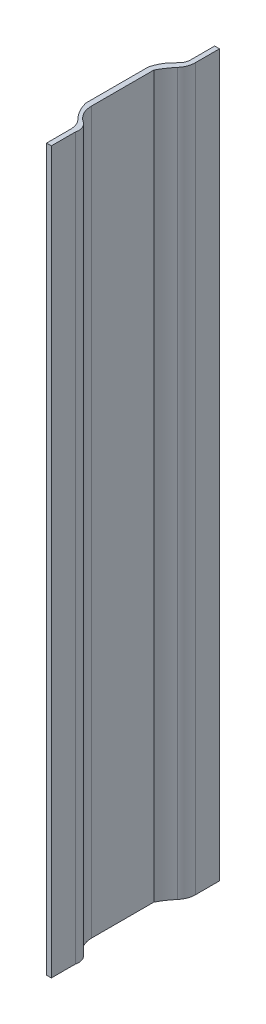
ISO-10303-21;
HEADER;
FILE_DESCRIPTION(('STEP AP214'),'2;1');
FILE_NAME('part.step','',(''),(''),'','','');
FILE_SCHEMA(('AUTOMOTIVE_DESIGN { 1 0 10303 214 1 1 1 1 }'));
ENDSEC;
DATA;
#1=APPLICATION_CONTEXT('core data for automotive mechanical design processes');
#2=APPLICATION_PROTOCOL_DEFINITION('international standard','automotive_design',2000,#1);
#3=PRODUCT_CONTEXT('',#1,'mechanical');
#4=PRODUCT('Part','Part','',(#3));
#5=PRODUCT_RELATED_PRODUCT_CATEGORY('part','',(#4));
#6=PRODUCT_DEFINITION_FORMATION('','',#4);
#7=PRODUCT_DEFINITION_CONTEXT('part definition',#1,'design');
#8=PRODUCT_DEFINITION('design','',#6,#7);
#9=PRODUCT_DEFINITION_SHAPE('','',#8);
#10=(LENGTH_UNIT() NAMED_UNIT(*) SI_UNIT(.MILLI.,.METRE.));
#11=(NAMED_UNIT(*) PLANE_ANGLE_UNIT() SI_UNIT($,.RADIAN.));
#12=(NAMED_UNIT(*) SI_UNIT($,.STERADIAN.) SOLID_ANGLE_UNIT());
#13=UNCERTAINTY_MEASURE_WITH_UNIT(LENGTH_MEASURE(1.E-05),#10,'distance_accuracy_value','');
#14=(GEOMETRIC_REPRESENTATION_CONTEXT(3) GLOBAL_UNCERTAINTY_ASSIGNED_CONTEXT((#13)) GLOBAL_UNIT_ASSIGNED_CONTEXT((#10,
#11,#12)) REPRESENTATION_CONTEXT('',''));
#15=CARTESIAN_POINT('',(0.,0.,0.));
#16=DIRECTION('',(0.,0.,1.));
#17=DIRECTION('',(1.,0.,0.));
#18=AXIS2_PLACEMENT_3D('',#15,#16,#17);
#19=CARTESIAN_POINT('',(-2.32260349166108,150.,12.2201935069024));
#20=DIRECTION('',(0.,-1.,0.));
#21=DIRECTION('',(0.,0.,-1.));
#22=AXIS2_PLACEMENT_3D('',#19,#20,#21);
#23=CYLINDRICAL_SURFACE('',#22,2.404629150066);
#24=CARTESIAN_POINT('',(-2.32260349166108,0.,12.2201935069024));
#25=DIRECTION('',(0.,1.,0.));
#26=DIRECTION('',(0.,0.,-1.));
#27=AXIS2_PLACEMENT_3D('',#24,#25,#26);
#28=CIRCLE('',#27,2.404629150066);
#29=CARTESIAN_POINT('',(0.,0.,12.8428927680798));
#30=VERTEX_POINT('',#29);
#31=CARTESIAN_POINT('',(-1.,0.,10.211970074813));
#32=VERTEX_POINT('',#31);
#33=EDGE_CURVE('E177',#30,#32,#28,.T.);
#34=ORIENTED_EDGE('',*,*,#33,.T.);
#35=DIRECTION('',(0.,-1.,0.));
#36=VECTOR('',#35,1.);
#37=CARTESIAN_POINT('',(-1.,150.,10.211970074813));
#38=LINE('',#37,#36);
#39=CARTESIAN_POINT('',(-1.,150.,10.211970074813));
#40=VERTEX_POINT('',#39);
#41=EDGE_CURVE('E11',#40,#32,#38,.T.);
#42=ORIENTED_EDGE('',*,*,#41,.F.);
#43=CARTESIAN_POINT('',(-2.32260349166108,150.,12.2201935069024));
#44=DIRECTION('',(0.,1.,0.));
#45=DIRECTION('',(0.,0.,-1.));
#46=AXIS2_PLACEMENT_3D('',#43,#44,#45);
#47=CIRCLE('',#46,2.404629150066);
#48=CARTESIAN_POINT('',(0.,150.,12.8428927680798));
#49=VERTEX_POINT('',#48);
#50=EDGE_CURVE('E207',#49,#40,#47,.T.);
#51=ORIENTED_EDGE('',*,*,#50,.F.);
#52=DIRECTION('',(0.,-1.,0.));
#53=VECTOR('',#52,1.);
#54=CARTESIAN_POINT('',(0.,150.,12.8428927680798));
#55=LINE('',#54,#53);
#56=EDGE_CURVE('E173',#49,#30,#55,.T.);
#57=ORIENTED_EDGE('',*,*,#56,.T.);
#58=EDGE_LOOP('',(#34,#42,#51,#57));
#59=FACE_BOUND('',#58,.T.);
#60=ADVANCED_FACE('F33',(#59),#23,.T.);
#61=CARTESIAN_POINT('',(1.44468045907675,150.,6.5));
#62=DIRECTION('',(0.,-1.,0.));
#63=DIRECTION('',(0.,0.,-1.));
#64=AXIS2_PLACEMENT_3D('',#61,#62,#63);
#65=CYLINDRICAL_SURFACE('',#64,4.44468045907675);
#66=CARTESIAN_POINT('',(1.44468045907675,0.,6.5));
#67=DIRECTION('',(0.,-1.,0.));
#68=DIRECTION('',(0.,0.,1.));
#69=AXIS2_PLACEMENT_3D('',#66,#67,#68);
#70=CIRCLE('',#69,4.44468045907675);
#71=CARTESIAN_POINT('',(-3.,0.,6.5));
#72=VERTEX_POINT('',#71);
#73=EDGE_CURVE('E180',#32,#72,#70,.T.);
#74=ORIENTED_EDGE('',*,*,#73,.T.);
#75=DIRECTION('',(0.,-1.,0.));
#76=VECTOR('',#75,1.);
#77=CARTESIAN_POINT('',(-3.,150.,6.5));
#78=LINE('',#77,#76);
#79=CARTESIAN_POINT('',(-3.,150.,6.5));
#80=VERTEX_POINT('',#79);
#81=EDGE_CURVE('E41',#80,#72,#78,.T.);
#82=ORIENTED_EDGE('',*,*,#81,.F.);
#83=CARTESIAN_POINT('',(1.44468045907675,150.,6.5));
#84=DIRECTION('',(0.,-1.,0.));
#85=DIRECTION('',(0.,0.,1.));
#86=AXIS2_PLACEMENT_3D('',#83,#84,#85);
#87=CIRCLE('',#86,4.44468045907675);
#88=EDGE_CURVE('E116',#40,#80,#87,.T.);
#89=ORIENTED_EDGE('',*,*,#88,.F.);
#90=ORIENTED_EDGE('',*,*,#41,.T.);
#91=EDGE_LOOP('',(#74,#82,#89,#90));
#92=FACE_BOUND('',#91,.T.);
#93=ADVANCED_FACE('F305',(#92),#65,.F.);
#94=CARTESIAN_POINT('',(-3.,150.,6.5));
#95=DIRECTION('',(-1.,0.,0.));
#96=DIRECTION('',(0.,0.,1.));
#97=AXIS2_PLACEMENT_3D('',#94,#95,#96);
#98=PLANE('',#97);
#99=DIRECTION('',(0.,0.,-1.));
#100=VECTOR('',#99,1.);
#101=CARTESIAN_POINT('',(-3.,0.,6.5));
#102=LINE('',#101,#100);
#103=CARTESIAN_POINT('',(-3.,0.,-6.50000000000001));
#104=VERTEX_POINT('',#103);
#105=EDGE_CURVE('E182',#72,#104,#102,.T.);
#106=ORIENTED_EDGE('',*,*,#105,.T.);
#107=DIRECTION('',(0.,-1.,0.));
#108=VECTOR('',#107,1.);
#109=CARTESIAN_POINT('',(-3.,150.,-6.50000000000001));
#110=LINE('',#109,#108);
#111=CARTESIAN_POINT('',(-3.,150.,-6.50000000000001));
#112=VERTEX_POINT('',#111);
#113=EDGE_CURVE('E238',#112,#104,#110,.T.);
#114=ORIENTED_EDGE('',*,*,#113,.F.);
#115=DIRECTION('',(0.,0.,-1.));
#116=VECTOR('',#115,1.);
#117=CARTESIAN_POINT('',(-3.,150.,6.5));
#118=LINE('',#117,#116);
#119=EDGE_CURVE('E246',#80,#112,#118,.T.);
#120=ORIENTED_EDGE('',*,*,#119,.F.);
#121=ORIENTED_EDGE('',*,*,#81,.T.);
#122=EDGE_LOOP('',(#106,#114,#120,#121));
#123=FACE_BOUND('',#122,.T.);
#124=ADVANCED_FACE('F244',(#123),#98,.F.);
#125=CARTESIAN_POINT('',(10.5618778674709,150.,0.494837099372666));
#126=DIRECTION('',(0.,-1.,0.));
#127=DIRECTION('',(0.,0.,-1.));
#128=AXIS2_PLACEMENT_3D('',#125,#126,#127);
#129=CYLINDRICAL_SURFACE('',#128,15.2594979386268);
#130=CARTESIAN_POINT('',(10.5618778674709,0.,0.494837099372666));
#131=DIRECTION('',(0.,-1.,0.));
#132=DIRECTION('',(0.,0.,1.));
#133=AXIS2_PLACEMENT_3D('',#130,#131,#132);
#134=CIRCLE('',#133,15.2594979386268);
#135=CARTESIAN_POINT('',(-1.,0.,-9.4638403990025));
#136=VERTEX_POINT('',#135);
#137=EDGE_CURVE('E184',#104,#136,#134,.T.);
#138=ORIENTED_EDGE('',*,*,#137,.T.);
#139=DIRECTION('',(0.,-1.,0.));
#140=VECTOR('',#139,1.);
#141=CARTESIAN_POINT('',(-1.,150.,-9.4638403990025));
#142=LINE('',#141,#140);
#143=CARTESIAN_POINT('',(-1.,150.,-9.4638403990025));
#144=VERTEX_POINT('',#143);
#145=EDGE_CURVE('E235',#144,#136,#142,.T.);
#146=ORIENTED_EDGE('',*,*,#145,.F.);
#147=CARTESIAN_POINT('',(10.5618778674709,150.,0.494837099372666));
#148=DIRECTION('',(0.,-1.,0.));
#149=DIRECTION('',(0.,0.,1.));
#150=AXIS2_PLACEMENT_3D('',#147,#148,#149);
#151=CIRCLE('',#150,15.2594979386268);
#152=EDGE_CURVE('E264',#112,#144,#151,.T.);
#153=ORIENTED_EDGE('',*,*,#152,.F.);
#154=ORIENTED_EDGE('',*,*,#113,.T.);
#155=EDGE_LOOP('',(#138,#146,#153,#154));
#156=FACE_BOUND('',#155,.T.);
#157=ADVANCED_FACE('F255',(#156),#129,.F.);
#158=CARTESIAN_POINT('',(-4.12684311664727,150.,-12.1571072319202));
#159=DIRECTION('',(0.,-1.,0.));
#160=DIRECTION('',(0.,0.,-1.));
#161=AXIS2_PLACEMENT_3D('',#158,#159,#160);
#162=CYLINDRICAL_SURFACE('',#161,4.12684311664727);
#163=CARTESIAN_POINT('',(-4.12684311664727,0.,-12.1571072319202));
#164=DIRECTION('',(0.,1.,0.));
#165=DIRECTION('',(0.,0.,-1.));
#166=AXIS2_PLACEMENT_3D('',#163,#164,#165);
#167=CIRCLE('',#166,4.12684311664727);
#168=CARTESIAN_POINT('',(0.,0.,-12.1571072319202));
#169=VERTEX_POINT('',#168);
#170=EDGE_CURVE('E186',#136,#169,#167,.T.);
#171=ORIENTED_EDGE('',*,*,#170,.T.);
#172=DIRECTION('',(0.,-1.,0.));
#173=VECTOR('',#172,1.);
#174=CARTESIAN_POINT('',(0.,150.,-12.1571072319202));
#175=LINE('',#174,#173);
#176=CARTESIAN_POINT('',(0.,150.,-12.1571072319202));
#177=VERTEX_POINT('',#176);
#178=EDGE_CURVE('E232',#177,#169,#175,.T.);
#179=ORIENTED_EDGE('',*,*,#178,.F.);
#180=CARTESIAN_POINT('',(-4.12684311664727,150.,-12.1571072319202));
#181=DIRECTION('',(0.,1.,0.));
#182=DIRECTION('',(0.,0.,-1.));
#183=AXIS2_PLACEMENT_3D('',#180,#181,#182);
#184=CIRCLE('',#183,4.12684311664727);
#185=EDGE_CURVE('E261',#144,#177,#184,.T.);
#186=ORIENTED_EDGE('',*,*,#185,.F.);
#187=ORIENTED_EDGE('',*,*,#145,.T.);
#188=EDGE_LOOP('',(#171,#179,#186,#187));
#189=FACE_BOUND('',#188,.T.);
#190=ADVANCED_FACE('F259',(#189),#162,.T.);
#191=CARTESIAN_POINT('',(0.,150.,-12.1571072319202));
#192=DIRECTION('',(-1.,0.,0.));
#193=DIRECTION('',(0.,0.,1.));
#194=AXIS2_PLACEMENT_3D('',#191,#192,#193);
#195=PLANE('',#194);
#196=DIRECTION('',(0.,0.,-1.));
#197=VECTOR('',#196,1.);
#198=CARTESIAN_POINT('',(0.,0.,-12.1571072319202));
#199=LINE('',#198,#197);
#200=CARTESIAN_POINT('',(0.,0.,-17.1571072319202));
#201=VERTEX_POINT('',#200);
#202=EDGE_CURVE('E188',#169,#201,#199,.T.);
#203=ORIENTED_EDGE('',*,*,#202,.T.);
#204=DIRECTION('',(0.,-1.,0.));
#205=VECTOR('',#204,1.);
#206=CARTESIAN_POINT('',(0.,150.,-17.1571072319202));
#207=LINE('',#206,#205);
#208=CARTESIAN_POINT('',(0.,150.,-17.1571072319202));
#209=VERTEX_POINT('',#208);
#210=EDGE_CURVE('E229',#209,#201,#207,.T.);
#211=ORIENTED_EDGE('',*,*,#210,.F.);
#212=DIRECTION('',(0.,0.,-1.));
#213=VECTOR('',#212,1.);
#214=CARTESIAN_POINT('',(0.,150.,-12.1571072319202));
#215=LINE('',#214,#213);
#216=EDGE_CURVE('E263',#177,#209,#215,.T.);
#217=ORIENTED_EDGE('',*,*,#216,.F.);
#218=ORIENTED_EDGE('',*,*,#178,.T.);
#219=EDGE_LOOP('',(#203,#211,#217,#218));
#220=FACE_BOUND('',#219,.T.);
#221=ADVANCED_FACE('F318',(#220),#195,.F.);
#222=CARTESIAN_POINT('',(0.,150.,-17.1571072319202));
#223=DIRECTION('',(0.,0.,1.));
#224=DIRECTION('',(1.,0.,0.));
#225=AXIS2_PLACEMENT_3D('',#222,#223,#224);
#226=PLANE('',#225);
#227=DIRECTION('',(-1.,0.,0.));
#228=VECTOR('',#227,1.);
#229=CARTESIAN_POINT('',(0.,0.,-17.1571072319202));
#230=LINE('',#229,#228);
#231=CARTESIAN_POINT('',(-1.,0.,-17.1571072319202));
#232=VERTEX_POINT('',#231);
#233=EDGE_CURVE('E190',#201,#232,#230,.T.);
#234=ORIENTED_EDGE('',*,*,#233,.T.);
#235=DIRECTION('',(0.,-1.,0.));
#236=VECTOR('',#235,1.);
#237=CARTESIAN_POINT('',(-1.,150.,-17.1571072319202));
#238=LINE('',#237,#236);
#239=CARTESIAN_POINT('',(-1.,150.,-17.1571072319202));
#240=VERTEX_POINT('',#239);
#241=EDGE_CURVE('E226',#240,#232,#238,.T.);
#242=ORIENTED_EDGE('',*,*,#241,.F.);
#243=DIRECTION('',(-1.,0.,0.));
#244=VECTOR('',#243,1.);
#245=CARTESIAN_POINT('',(0.,150.,-17.1571072319202));
#246=LINE('',#245,#244);
#247=EDGE_CURVE('E266',#209,#240,#246,.T.);
#248=ORIENTED_EDGE('',*,*,#247,.F.);
#249=ORIENTED_EDGE('',*,*,#210,.T.);
#250=EDGE_LOOP('',(#234,#242,#248,#249));
#251=FACE_BOUND('',#250,.T.);
#252=ADVANCED_FACE('F321',(#251),#226,.F.);
#253=CARTESIAN_POINT('',(-1.,150.,-17.1571072319202));
#254=DIRECTION('',(1.,0.,0.));
#255=DIRECTION('',(0.,0.,-1.));
#256=AXIS2_PLACEMENT_3D('',#253,#254,#255);
#257=PLANE('',#256);
#258=DIRECTION('',(0.,0.,1.));
#259=VECTOR('',#258,1.);
#260=CARTESIAN_POINT('',(-1.,0.,-17.1571072319202));
#261=LINE('',#260,#259);
#262=CARTESIAN_POINT('',(-1.,0.,-12.1571072319202));
#263=VERTEX_POINT('',#262);
#264=EDGE_CURVE('E192',#232,#263,#261,.T.);
#265=ORIENTED_EDGE('',*,*,#264,.T.);
#266=DIRECTION('',(0.,-1.,0.));
#267=VECTOR('',#266,1.);
#268=CARTESIAN_POINT('',(-1.,150.,-12.1571072319202));
#269=LINE('',#268,#267);
#270=CARTESIAN_POINT('',(-1.,150.,-12.1571072319202));
#271=VERTEX_POINT('',#270);
#272=EDGE_CURVE('E223',#271,#263,#269,.T.);
#273=ORIENTED_EDGE('',*,*,#272,.F.);
#274=DIRECTION('',(0.,0.,1.));
#275=VECTOR('',#274,1.);
#276=CARTESIAN_POINT('',(-1.,150.,-17.1571072319202));
#277=LINE('',#276,#275);
#278=EDGE_CURVE('E272',#240,#271,#277,.T.);
#279=ORIENTED_EDGE('',*,*,#278,.F.);
#280=ORIENTED_EDGE('',*,*,#241,.T.);
#281=EDGE_LOOP('',(#265,#273,#279,#280));
#282=FACE_BOUND('',#281,.T.);
#283=ADVANCED_FACE('F325',(#282),#257,.F.);
#284=CARTESIAN_POINT('',(-3.51637373631786,150.,-12.1571072319202));
#285=DIRECTION('',(0.,-1.,0.));
#286=DIRECTION('',(0.,0.,-1.));
#287=AXIS2_PLACEMENT_3D('',#284,#285,#286);
#288=CYLINDRICAL_SURFACE('',#287,2.51637373631786);
#289=CARTESIAN_POINT('',(-3.51637373631786,0.,-12.1571072319202));
#290=DIRECTION('',(0.,-1.,0.));
#291=DIRECTION('',(0.,0.,-1.));
#292=AXIS2_PLACEMENT_3D('',#289,#290,#291);
#293=CIRCLE('',#292,2.51637373631786);
#294=CARTESIAN_POINT('',(-1.83291770573567,0.,-10.286783042394));
#295=VERTEX_POINT('',#294);
#296=EDGE_CURVE('E194',#263,#295,#293,.T.);
#297=ORIENTED_EDGE('',*,*,#296,.T.);
#298=DIRECTION('',(0.,-1.,0.));
#299=VECTOR('',#298,1.);
#300=CARTESIAN_POINT('',(-1.83291770573567,150.,-10.286783042394));
#301=LINE('',#300,#299);
#302=CARTESIAN_POINT('',(-1.83291770573567,150.,-10.286783042394));
#303=VERTEX_POINT('',#302);
#304=EDGE_CURVE('E220',#303,#295,#301,.T.);
#305=ORIENTED_EDGE('',*,*,#304,.F.);
#306=CARTESIAN_POINT('',(-3.51637373631786,150.,-12.1571072319202));
#307=DIRECTION('',(0.,-1.,0.));
#308=DIRECTION('',(0.,0.,-1.));
#309=AXIS2_PLACEMENT_3D('',#306,#307,#308);
#310=CIRCLE('',#309,2.51637373631786);
#311=EDGE_CURVE('E274',#271,#303,#310,.T.);
#312=ORIENTED_EDGE('',*,*,#311,.F.);
#313=ORIENTED_EDGE('',*,*,#272,.T.);
#314=EDGE_LOOP('',(#297,#305,#312,#313));
#315=FACE_BOUND('',#314,.T.);
#316=ADVANCED_FACE('F329',(#315),#288,.F.);
#317=CARTESIAN_POINT('',(3.28986397136929,150.,-4.59535878521437));
#318=DIRECTION('',(0.,-1.,0.));
#319=DIRECTION('',(0.,0.,-1.));
#320=AXIS2_PLACEMENT_3D('',#317,#318,#319);
#321=CYLINDRICAL_SURFACE('',#320,7.65736261296899);
#322=CARTESIAN_POINT('',(3.28986397136929,0.,-4.59535878521437));
#323=DIRECTION('',(0.,1.,0.));
#324=DIRECTION('',(0.,0.,1.));
#325=AXIS2_PLACEMENT_3D('',#322,#323,#324);
#326=CIRCLE('',#325,7.65736261296899);
#327=CARTESIAN_POINT('',(-4.12684311664727,0.,-6.5));
#328=VERTEX_POINT('',#327);
#329=EDGE_CURVE('E196',#295,#328,#326,.T.);
#330=ORIENTED_EDGE('',*,*,#329,.T.);
#331=DIRECTION('',(0.,-1.,0.));
#332=VECTOR('',#331,1.);
#333=CARTESIAN_POINT('',(-4.12684311664727,150.,-6.5));
#334=LINE('',#333,#332);
#335=CARTESIAN_POINT('',(-4.12684311664727,150.,-6.5));
#336=VERTEX_POINT('',#335);
#337=EDGE_CURVE('E217',#336,#328,#334,.T.);
#338=ORIENTED_EDGE('',*,*,#337,.F.);
#339=CARTESIAN_POINT('',(3.28986397136929,150.,-4.59535878521437));
#340=DIRECTION('',(0.,1.,0.));
#341=DIRECTION('',(0.,0.,1.));
#342=AXIS2_PLACEMENT_3D('',#339,#340,#341);
#343=CIRCLE('',#342,7.65736261296899);
#344=EDGE_CURVE('E276',#303,#336,#343,.T.);
#345=ORIENTED_EDGE('',*,*,#344,.F.);
#346=ORIENTED_EDGE('',*,*,#304,.T.);
#347=EDGE_LOOP('',(#330,#338,#345,#346));
#348=FACE_BOUND('',#347,.T.);
#349=ADVANCED_FACE('F333',(#348),#321,.T.);
#350=CARTESIAN_POINT('',(-4.12684311664727,150.,-6.5));
#351=DIRECTION('',(1.,0.,0.));
#352=DIRECTION('',(0.,0.,-1.));
#353=AXIS2_PLACEMENT_3D('',#350,#351,#352);
#354=PLANE('',#353);
#355=DIRECTION('',(0.,0.,1.));
#356=VECTOR('',#355,1.);
#357=CARTESIAN_POINT('',(-4.12684311664727,0.,-6.5));
#358=LINE('',#357,#356);
#359=CARTESIAN_POINT('',(-4.12684311664727,0.,6.50000000000004));
#360=VERTEX_POINT('',#359);
#361=EDGE_CURVE('E198',#328,#360,#358,.T.);
#362=ORIENTED_EDGE('',*,*,#361,.T.);
#363=DIRECTION('',(0.,-1.,0.));
#364=VECTOR('',#363,1.);
#365=CARTESIAN_POINT('',(-4.12684311664727,150.,6.50000000000004));
#366=LINE('',#365,#364);
#367=CARTESIAN_POINT('',(-4.12684311664727,150.,6.50000000000004));
#368=VERTEX_POINT('',#367);
#369=EDGE_CURVE('E214',#368,#360,#366,.T.);
#370=ORIENTED_EDGE('',*,*,#369,.F.);
#371=DIRECTION('',(0.,0.,1.));
#372=VECTOR('',#371,1.);
#373=CARTESIAN_POINT('',(-4.12684311664727,150.,-6.5));
#374=LINE('',#373,#372);
#375=EDGE_CURVE('E278',#336,#368,#374,.T.);
#376=ORIENTED_EDGE('',*,*,#375,.F.);
#377=ORIENTED_EDGE('',*,*,#337,.T.);
#378=EDGE_LOOP('',(#362,#370,#376,#377));
#379=FACE_BOUND('',#378,.T.);
#380=ADVANCED_FACE('F337',(#379),#354,.F.);
#381=CARTESIAN_POINT('',(3.31802371490708,150.,4.82543597616386));
#382=DIRECTION('',(0.,-1.,0.));
#383=DIRECTION('',(0.,0.,-1.));
#384=AXIS2_PLACEMENT_3D('',#381,#382,#383);
#385=CYLINDRICAL_SURFACE('',#384,7.63087195604176);
#386=CARTESIAN_POINT('',(3.31802371490708,0.,4.82543597616386));
#387=DIRECTION('',(0.,1.,0.));
#388=DIRECTION('',(0.,0.,-1.));
#389=AXIS2_PLACEMENT_3D('',#386,#387,#388);
#390=CIRCLE('',#389,7.63087195604176);
#391=CARTESIAN_POINT('',(-2.0871087731634,0.,10.211970074813));
#392=VERTEX_POINT('',#391);
#393=EDGE_CURVE('E200',#360,#392,#390,.T.);
#394=ORIENTED_EDGE('',*,*,#393,.T.);
#395=DIRECTION('',(0.,-1.,0.));
#396=VECTOR('',#395,1.);
#397=CARTESIAN_POINT('',(-2.0871087731634,150.,10.211970074813));
#398=LINE('',#397,#396);
#399=CARTESIAN_POINT('',(-2.0871087731634,150.,10.211970074813));
#400=VERTEX_POINT('',#399);
#401=EDGE_CURVE('E211',#400,#392,#398,.T.);
#402=ORIENTED_EDGE('',*,*,#401,.F.);
#403=CARTESIAN_POINT('',(3.31802371490708,150.,4.82543597616386));
#404=DIRECTION('',(0.,1.,0.));
#405=DIRECTION('',(0.,0.,-1.));
#406=AXIS2_PLACEMENT_3D('',#403,#404,#405);
#407=CIRCLE('',#406,7.63087195604176);
#408=EDGE_CURVE('E280',#368,#400,#407,.T.);
#409=ORIENTED_EDGE('',*,*,#408,.F.);
#410=ORIENTED_EDGE('',*,*,#369,.T.);
#411=EDGE_LOOP('',(#394,#402,#409,#410));
#412=FACE_BOUND('',#411,.T.);
#413=ADVANCED_FACE('F286',(#412),#385,.T.);
#414=CARTESIAN_POINT('',(-4.72711540127419,150.,12.8428927680798));
#415=DIRECTION('',(0.,-1.,0.));
#416=DIRECTION('',(0.,0.,-1.));
#417=AXIS2_PLACEMENT_3D('',#414,#415,#416);
#418=CYLINDRICAL_SURFACE('',#417,3.72711540127419);
#419=CARTESIAN_POINT('',(-4.72711540127419,0.,12.8428927680798));
#420=DIRECTION('',(0.,-1.,0.));
#421=DIRECTION('',(0.,0.,1.));
#422=AXIS2_PLACEMENT_3D('',#419,#420,#421);
#423=CIRCLE('',#422,3.72711540127419);
#424=CARTESIAN_POINT('',(-1.,0.,12.8428927680798));
#425=VERTEX_POINT('',#424);
#426=EDGE_CURVE('E202',#392,#425,#423,.T.);
#427=ORIENTED_EDGE('',*,*,#426,.T.);
#428=DIRECTION('',(0.,-1.,0.));
#429=VECTOR('',#428,1.);
#430=CARTESIAN_POINT('',(-1.,150.,12.8428927680798));
#431=LINE('',#430,#429);
#432=CARTESIAN_POINT('',(-1.,150.,12.8428927680798));
#433=VERTEX_POINT('',#432);
#434=EDGE_CURVE('E168',#433,#425,#431,.T.);
#435=ORIENTED_EDGE('',*,*,#434,.F.);
#436=CARTESIAN_POINT('',(-4.72711540127419,150.,12.8428927680798));
#437=DIRECTION('',(0.,-1.,0.));
#438=DIRECTION('',(0.,0.,1.));
#439=AXIS2_PLACEMENT_3D('',#436,#437,#438);
#440=CIRCLE('',#439,3.72711540127419);
#441=EDGE_CURVE('E159',#400,#433,#440,.T.);
#442=ORIENTED_EDGE('',*,*,#441,.F.);
#443=ORIENTED_EDGE('',*,*,#401,.T.);
#444=EDGE_LOOP('',(#427,#435,#442,#443));
#445=FACE_BOUND('',#444,.T.);
#446=ADVANCED_FACE('F290',(#445),#418,.F.);
#447=CARTESIAN_POINT('',(-1.,150.,17.8428927680798));
#448=DIRECTION('',(1.,0.,0.));
#449=DIRECTION('',(0.,0.,-1.));
#450=AXIS2_PLACEMENT_3D('',#447,#448,#449);
#451=PLANE('',#450);
#452=DIRECTION('',(0.,0.,1.));
#453=VECTOR('',#452,1.);
#454=CARTESIAN_POINT('',(-1.,0.,17.8428927680798));
#455=LINE('',#454,#453);
#456=CARTESIAN_POINT('',(-1.,0.,17.8428927680798));
#457=VERTEX_POINT('',#456);
#458=EDGE_CURVE('E167',#425,#457,#455,.T.);
#459=ORIENTED_EDGE('',*,*,#458,.T.);
#460=DIRECTION('',(0.,-1.,0.));
#461=VECTOR('',#460,1.);
#462=CARTESIAN_POINT('',(-1.,150.,17.8428927680798));
#463=LINE('',#462,#461);
#464=CARTESIAN_POINT('',(-1.,150.,17.8428927680798));
#465=VERTEX_POINT('',#464);
#466=EDGE_CURVE('E164',#465,#457,#463,.T.);
#467=ORIENTED_EDGE('',*,*,#466,.F.);
#468=DIRECTION('',(0.,0.,1.));
#469=VECTOR('',#468,1.);
#470=CARTESIAN_POINT('',(-1.,150.,17.8428927680798));
#471=LINE('',#470,#469);
#472=EDGE_CURVE('E153',#433,#465,#471,.T.);
#473=ORIENTED_EDGE('',*,*,#472,.F.);
#474=ORIENTED_EDGE('',*,*,#434,.T.);
#475=EDGE_LOOP('',(#459,#467,#473,#474));
#476=FACE_BOUND('',#475,.T.);
#477=ADVANCED_FACE('F165',(#476),#451,.F.);
#478=CARTESIAN_POINT('',(0.,150.,17.8428927680798));
#479=DIRECTION('',(0.,0.,-1.));
#480=DIRECTION('',(-1.,0.,0.));
#481=AXIS2_PLACEMENT_3D('',#478,#479,#480);
#482=PLANE('',#481);
#483=DIRECTION('',(1.,0.,0.));
#484=VECTOR('',#483,1.);
#485=CARTESIAN_POINT('',(0.,0.,17.8428927680798));
#486=LINE('',#485,#484);
#487=CARTESIAN_POINT('',(0.,0.,17.8428927680798));
#488=VERTEX_POINT('',#487);
#489=EDGE_CURVE('E102',#457,#488,#486,.T.);
#490=ORIENTED_EDGE('',*,*,#489,.T.);
#491=DIRECTION('',(0.,-1.,0.));
#492=VECTOR('',#491,1.);
#493=CARTESIAN_POINT('',(0.,150.,17.8428927680798));
#494=LINE('',#493,#492);
#495=CARTESIAN_POINT('',(0.,150.,17.8428927680798));
#496=VERTEX_POINT('',#495);
#497=EDGE_CURVE('E169',#496,#488,#494,.T.);
#498=ORIENTED_EDGE('',*,*,#497,.F.);
#499=DIRECTION('',(1.,0.,0.));
#500=VECTOR('',#499,1.);
#501=CARTESIAN_POINT('',(0.,150.,17.8428927680798));
#502=LINE('',#501,#500);
#503=EDGE_CURVE('E157',#465,#496,#502,.T.);
#504=ORIENTED_EDGE('',*,*,#503,.F.);
#505=ORIENTED_EDGE('',*,*,#466,.T.);
#506=EDGE_LOOP('',(#490,#498,#504,#505));
#507=FACE_BOUND('',#506,.T.);
#508=ADVANCED_FACE('F171',(#507),#482,.F.);
#509=CARTESIAN_POINT('',(0.,150.,17.8428927680798));
#510=DIRECTION('',(-1.,0.,0.));
#511=DIRECTION('',(0.,0.,1.));
#512=AXIS2_PLACEMENT_3D('',#509,#510,#511);
#513=PLANE('',#512);
#514=DIRECTION('',(0.,0.,-1.));
#515=VECTOR('',#514,1.);
#516=CARTESIAN_POINT('',(0.,0.,17.8428927680798));
#517=LINE('',#516,#515);
#518=EDGE_CURVE('E108',#488,#30,#517,.T.);
#519=ORIENTED_EDGE('',*,*,#518,.T.);
#520=ORIENTED_EDGE('',*,*,#56,.F.);
#521=DIRECTION('',(0.,0.,-1.));
#522=VECTOR('',#521,1.);
#523=CARTESIAN_POINT('',(0.,150.,17.8428927680798));
#524=LINE('',#523,#522);
#525=EDGE_CURVE('E49',#496,#49,#524,.T.);
#526=ORIENTED_EDGE('',*,*,#525,.F.);
#527=ORIENTED_EDGE('',*,*,#497,.T.);
#528=EDGE_LOOP('',(#519,#520,#526,#527));
#529=FACE_BOUND('',#528,.T.);
#530=ADVANCED_FACE('F294',(#529),#513,.F.);
#531=CARTESIAN_POINT('',(-2.32260349166108,150.,12.2201935069024));
#532=DIRECTION('',(0.,-1.,0.));
#533=DIRECTION('',(0.,0.,-1.));
#534=AXIS2_PLACEMENT_3D('',#531,#532,#533);
#535=PLANE('',#534);
#536=ORIENTED_EDGE('',*,*,#50,.T.);
#537=ORIENTED_EDGE('',*,*,#88,.T.);
#538=ORIENTED_EDGE('',*,*,#119,.T.);
#539=ORIENTED_EDGE('',*,*,#152,.T.);
#540=ORIENTED_EDGE('',*,*,#185,.T.);
#541=ORIENTED_EDGE('',*,*,#216,.T.);
#542=ORIENTED_EDGE('',*,*,#247,.T.);
#543=ORIENTED_EDGE('',*,*,#278,.T.);
#544=ORIENTED_EDGE('',*,*,#311,.T.);
#545=ORIENTED_EDGE('',*,*,#344,.T.);
#546=ORIENTED_EDGE('',*,*,#375,.T.);
#547=ORIENTED_EDGE('',*,*,#408,.T.);
#548=ORIENTED_EDGE('',*,*,#441,.T.);
#549=ORIENTED_EDGE('',*,*,#472,.T.);
#550=ORIENTED_EDGE('',*,*,#503,.T.);
#551=ORIENTED_EDGE('',*,*,#525,.T.);
#552=EDGE_LOOP('',(#536,#537,#538,#539,#540,#541,#542,#543,#544,#545,#546,#547,#548,#549,#550,#551));
#553=FACE_BOUND('',#552,.T.);
#554=ADVANCED_FACE('F155',(#553),#535,.F.);
#555=CARTESIAN_POINT('',(-2.32260349166108,0.,12.2201935069024));
#556=DIRECTION('',(0.,-1.,0.));
#557=DIRECTION('',(0.,0.,-1.));
#558=AXIS2_PLACEMENT_3D('',#555,#556,#557);
#559=PLANE('',#558);
#560=ORIENTED_EDGE('',*,*,#33,.F.);
#561=ORIENTED_EDGE('',*,*,#518,.F.);
#562=ORIENTED_EDGE('',*,*,#489,.F.);
#563=ORIENTED_EDGE('',*,*,#458,.F.);
#564=ORIENTED_EDGE('',*,*,#426,.F.);
#565=ORIENTED_EDGE('',*,*,#393,.F.);
#566=ORIENTED_EDGE('',*,*,#361,.F.);
#567=ORIENTED_EDGE('',*,*,#329,.F.);
#568=ORIENTED_EDGE('',*,*,#296,.F.);
#569=ORIENTED_EDGE('',*,*,#264,.F.);
#570=ORIENTED_EDGE('',*,*,#233,.F.);
#571=ORIENTED_EDGE('',*,*,#202,.F.);
#572=ORIENTED_EDGE('',*,*,#170,.F.);
#573=ORIENTED_EDGE('',*,*,#137,.F.);
#574=ORIENTED_EDGE('',*,*,#105,.F.);
#575=ORIENTED_EDGE('',*,*,#73,.F.);
#576=EDGE_LOOP('',(#560,#561,#562,#563,#564,#565,#566,#567,#568,#569,#570,#571,#572,#573,#574,#575));
#577=FACE_BOUND('',#576,.T.);
#578=ADVANCED_FACE('F250',(#577),#559,.T.);
#579=CLOSED_SHELL('',(#60,#93,#124,#157,#190,#221,#252,#283,#316,#349,#380,#413,#446,#477,#508,
#530,#554,#578));
#580=MANIFOLD_SOLID_BREP('B2',#579);
#581=ADVANCED_BREP_SHAPE_REPRESENTATION('',(#18,#580),#14);
#582=SHAPE_DEFINITION_REPRESENTATION(#9,#581);
ENDSEC;
END-ISO-10303-21;
